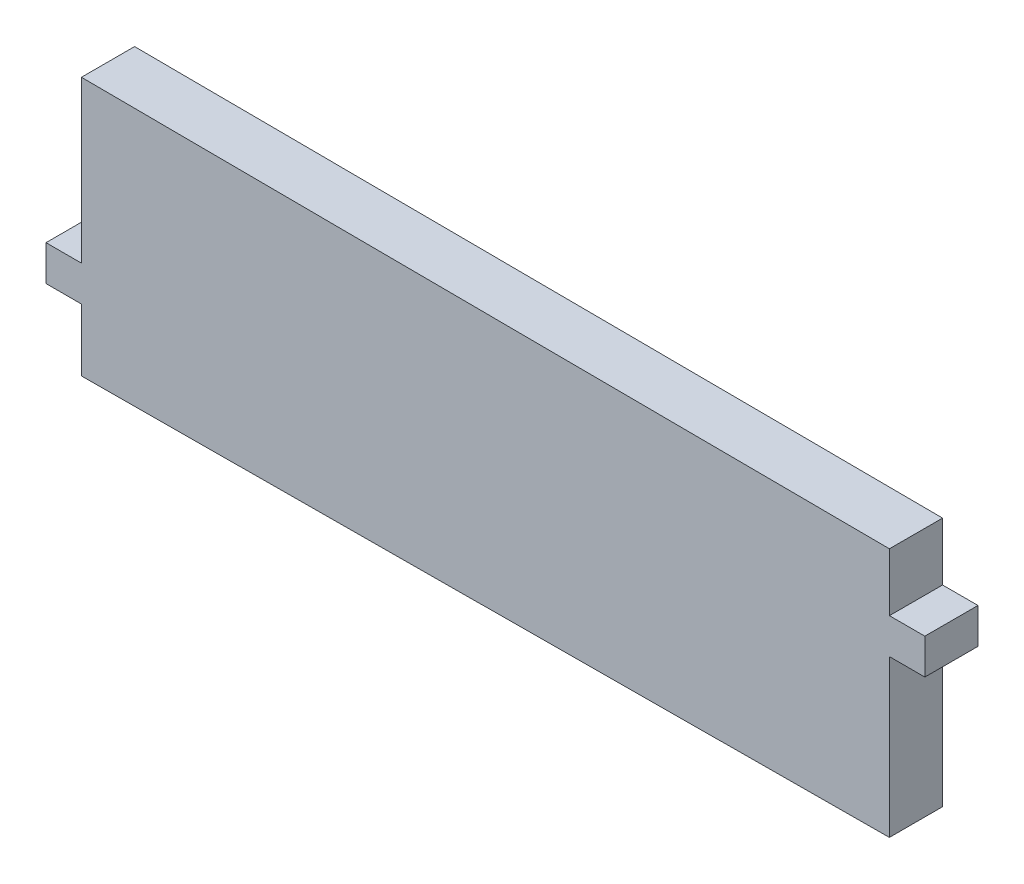
ISO-10303-21;
HEADER;
FILE_DESCRIPTION(('STEP AP214'),'2;1');
FILE_NAME('part.step','',(''),(''),'','','');
FILE_SCHEMA(('AUTOMOTIVE_DESIGN { 1 0 10303 214 1 1 1 1 }'));
ENDSEC;
DATA;
#1=APPLICATION_CONTEXT('core data for automotive mechanical design processes');
#2=APPLICATION_PROTOCOL_DEFINITION('international standard','automotive_design',2000,#1);
#3=PRODUCT_CONTEXT('',#1,'mechanical');
#4=PRODUCT('Part','Part','',(#3));
#5=PRODUCT_RELATED_PRODUCT_CATEGORY('part','',(#4));
#6=PRODUCT_DEFINITION_FORMATION('','',#4);
#7=PRODUCT_DEFINITION_CONTEXT('part definition',#1,'design');
#8=PRODUCT_DEFINITION('design','',#6,#7);
#9=PRODUCT_DEFINITION_SHAPE('','',#8);
#10=(LENGTH_UNIT() NAMED_UNIT(*) SI_UNIT(.MILLI.,.METRE.));
#11=(NAMED_UNIT(*) PLANE_ANGLE_UNIT() SI_UNIT($,.RADIAN.));
#12=(NAMED_UNIT(*) SI_UNIT($,.STERADIAN.) SOLID_ANGLE_UNIT());
#13=UNCERTAINTY_MEASURE_WITH_UNIT(LENGTH_MEASURE(1.E-05),#10,'distance_accuracy_value','');
#14=(GEOMETRIC_REPRESENTATION_CONTEXT(3) GLOBAL_UNCERTAINTY_ASSIGNED_CONTEXT((#13)) GLOBAL_UNIT_ASSIGNED_CONTEXT((#10,
#11,#12)) REPRESENTATION_CONTEXT('',''));
#15=CARTESIAN_POINT('',(0.,0.,0.));
#16=DIRECTION('',(0.,0.,1.));
#17=DIRECTION('',(1.,0.,0.));
#18=AXIS2_PLACEMENT_3D('',#15,#16,#17);
#19=CARTESIAN_POINT('',(15.8059102658461,-23.2863674981757,86.8430095923208));
#20=DIRECTION('',(1.,0.,0.));
#21=DIRECTION('',(0.,0.,-1.));
#22=AXIS2_PLACEMENT_3D('',#19,#20,#21);
#23=PLANE('',#22);
#24=DIRECTION('',(0.,-1.,0.));
#25=VECTOR('',#24,1.);
#26=CARTESIAN_POINT('',(15.8059102658461,-23.2863674981757,4.7625));
#27=LINE('',#26,#25);
#28=CARTESIAN_POINT('',(15.8059102658461,-8.86519562874355,4.7625));
#29=VERTEX_POINT('',#28);
#30=CARTESIAN_POINT('',(15.8059102658461,-23.2863674981757,4.7625));
#31=VERTEX_POINT('',#30);
#32=EDGE_CURVE('E167',#29,#31,#27,.T.);
#33=ORIENTED_EDGE('',*,*,#32,.F.);
#34=DIRECTION('',(0.,0.,-1.));
#35=VECTOR('',#34,1.);
#36=CARTESIAN_POINT('',(15.8059102658461,-8.86519562874355,86.8430095923208));
#37=LINE('',#36,#35);
#38=CARTESIAN_POINT('',(15.8059102658461,-8.86519562874355,0.));
#39=VERTEX_POINT('',#38);
#40=EDGE_CURVE('E36',#29,#39,#37,.T.);
#41=ORIENTED_EDGE('',*,*,#40,.T.);
#42=DIRECTION('',(0.,-1.,0.));
#43=VECTOR('',#42,1.);
#44=CARTESIAN_POINT('',(15.8059102658461,-23.2863674981757,0.));
#45=LINE('',#44,#43);
#46=CARTESIAN_POINT('',(15.8059102658461,-23.2863674981757,0.));
#47=VERTEX_POINT('',#46);
#48=EDGE_CURVE('E175',#39,#47,#45,.T.);
#49=ORIENTED_EDGE('',*,*,#48,.T.);
#50=DIRECTION('',(0.,0.,-1.));
#51=VECTOR('',#50,1.);
#52=CARTESIAN_POINT('',(15.8059102658461,-23.2863674981757,86.8430095923208));
#53=LINE('',#52,#51);
#54=EDGE_CURVE('E103',#31,#47,#53,.T.);
#55=ORIENTED_EDGE('',*,*,#54,.F.);
#56=EDGE_LOOP('',(#33,#41,#49,#55));
#57=FACE_BOUND('',#56,.T.);
#58=ADVANCED_FACE('F32',(#57),#23,.F.);
#59=CARTESIAN_POINT('',(15.8059102658461,-23.2863674981757,86.8430095923208));
#60=DIRECTION('',(0.,-1.,0.));
#61=DIRECTION('',(0.,0.,-1.));
#62=AXIS2_PLACEMENT_3D('',#59,#60,#61);
#63=PLANE('',#62);
#64=DIRECTION('',(-1.,0.,0.));
#65=VECTOR('',#64,1.);
#66=CARTESIAN_POINT('',(15.8059102658461,-23.2863674981757,4.7625));
#67=LINE('',#66,#65);
#68=CARTESIAN_POINT('',(12.6309102658461,-23.2863674981757,4.7625));
#69=VERTEX_POINT('',#68);
#70=EDGE_CURVE('E110',#31,#69,#67,.T.);
#71=ORIENTED_EDGE('',*,*,#70,.F.);
#72=ORIENTED_EDGE('',*,*,#54,.T.);
#73=DIRECTION('',(-1.,0.,0.));
#74=VECTOR('',#73,1.);
#75=CARTESIAN_POINT('',(15.8059102658461,-23.2863674981757,0.));
#76=LINE('',#75,#74);
#77=CARTESIAN_POINT('',(12.6309102658461,-23.2863674981757,0.));
#78=VERTEX_POINT('',#77);
#79=EDGE_CURVE('E174',#47,#78,#76,.T.);
#80=ORIENTED_EDGE('',*,*,#79,.T.);
#81=DIRECTION('',(0.,0.,-1.));
#82=VECTOR('',#81,1.);
#83=CARTESIAN_POINT('',(12.6309102658461,-23.2863674981757,86.8430095923208));
#84=LINE('',#83,#82);
#85=EDGE_CURVE('E176',#69,#78,#84,.T.);
#86=ORIENTED_EDGE('',*,*,#85,.F.);
#87=EDGE_LOOP('',(#71,#72,#80,#86));
#88=FACE_BOUND('',#87,.T.);
#89=ADVANCED_FACE('F225',(#88),#63,.F.);
#90=CARTESIAN_POINT('',(12.6309102658461,-23.2863674981757,86.8430095923208));
#91=DIRECTION('',(1.,0.,0.));
#92=DIRECTION('',(0.,0.,-1.));
#93=AXIS2_PLACEMENT_3D('',#90,#91,#92);
#94=PLANE('',#93);
#95=DIRECTION('',(0.,-1.,0.));
#96=VECTOR('',#95,1.);
#97=CARTESIAN_POINT('',(12.6309102658461,-23.2863674981757,4.7625));
#98=LINE('',#97,#96);
#99=CARTESIAN_POINT('',(12.6309102658461,-26.4613674981758,4.7625));
#100=VERTEX_POINT('',#99);
#101=EDGE_CURVE('E163',#69,#100,#98,.T.);
#102=ORIENTED_EDGE('',*,*,#101,.F.);
#103=ORIENTED_EDGE('',*,*,#85,.T.);
#104=DIRECTION('',(0.,-1.,0.));
#105=VECTOR('',#104,1.);
#106=CARTESIAN_POINT('',(12.6309102658461,-23.2863674981757,0.));
#107=LINE('',#106,#105);
#108=CARTESIAN_POINT('',(12.6309102658461,-26.4613674981758,0.));
#109=VERTEX_POINT('',#108);
#110=EDGE_CURVE('E178',#78,#109,#107,.T.);
#111=ORIENTED_EDGE('',*,*,#110,.T.);
#112=DIRECTION('',(0.,0.,-1.));
#113=VECTOR('',#112,1.);
#114=CARTESIAN_POINT('',(12.6309102658461,-26.4613674981758,86.8430095923208));
#115=LINE('',#114,#113);
#116=EDGE_CURVE('E179',#100,#109,#115,.T.);
#117=ORIENTED_EDGE('',*,*,#116,.F.);
#118=EDGE_LOOP('',(#102,#103,#111,#117));
#119=FACE_BOUND('',#118,.T.);
#120=ADVANCED_FACE('F228',(#119),#94,.F.);
#121=CARTESIAN_POINT('',(12.6309102658461,-26.4613674981758,86.8430095923208));
#122=DIRECTION('',(0.,1.,0.));
#123=DIRECTION('',(0.,0.,1.));
#124=AXIS2_PLACEMENT_3D('',#121,#122,#123);
#125=PLANE('',#124);
#126=DIRECTION('',(1.,0.,0.));
#127=VECTOR('',#126,1.);
#128=CARTESIAN_POINT('',(12.6309102658461,-26.4613674981758,4.7625));
#129=LINE('',#128,#127);
#130=CARTESIAN_POINT('',(15.8059102658461,-26.4613674981758,4.7625));
#131=VERTEX_POINT('',#130);
#132=EDGE_CURVE('E160',#100,#131,#129,.T.);
#133=ORIENTED_EDGE('',*,*,#132,.F.);
#134=ORIENTED_EDGE('',*,*,#116,.T.);
#135=DIRECTION('',(1.,0.,0.));
#136=VECTOR('',#135,1.);
#137=CARTESIAN_POINT('',(12.6309102658461,-26.4613674981758,0.));
#138=LINE('',#137,#136);
#139=CARTESIAN_POINT('',(15.8059102658461,-26.4613674981758,0.));
#140=VERTEX_POINT('',#139);
#141=EDGE_CURVE('E181',#109,#140,#138,.T.);
#142=ORIENTED_EDGE('',*,*,#141,.T.);
#143=DIRECTION('',(0.,0.,-1.));
#144=VECTOR('',#143,1.);
#145=CARTESIAN_POINT('',(15.8059102658461,-26.4613674981758,86.8430095923208));
#146=LINE('',#145,#144);
#147=EDGE_CURVE('E182',#131,#140,#146,.T.);
#148=ORIENTED_EDGE('',*,*,#147,.F.);
#149=EDGE_LOOP('',(#133,#134,#142,#148));
#150=FACE_BOUND('',#149,.T.);
#151=ADVANCED_FACE('F230',(#150),#125,.F.);
#152=CARTESIAN_POINT('',(15.8059102658461,-26.4613674981758,86.8430095923208));
#153=DIRECTION('',(1.,0.,0.));
#154=DIRECTION('',(0.,0.,-1.));
#155=AXIS2_PLACEMENT_3D('',#152,#153,#154);
#156=PLANE('',#155);
#157=DIRECTION('',(0.,-1.,0.));
#158=VECTOR('',#157,1.);
#159=CARTESIAN_POINT('',(15.8059102658461,-26.4613674981758,4.7625));
#160=LINE('',#159,#158);
#161=CARTESIAN_POINT('',(15.8059102658461,-32.0432554037779,4.7625));
#162=VERTEX_POINT('',#161);
#163=EDGE_CURVE('E157',#131,#162,#160,.T.);
#164=ORIENTED_EDGE('',*,*,#163,.F.);
#165=ORIENTED_EDGE('',*,*,#147,.T.);
#166=DIRECTION('',(0.,-1.,0.));
#167=VECTOR('',#166,1.);
#168=CARTESIAN_POINT('',(15.8059102658461,-26.4613674981758,0.));
#169=LINE('',#168,#167);
#170=CARTESIAN_POINT('',(15.8059102658461,-32.0432554037779,0.));
#171=VERTEX_POINT('',#170);
#172=EDGE_CURVE('E184',#140,#171,#169,.T.);
#173=ORIENTED_EDGE('',*,*,#172,.T.);
#174=DIRECTION('',(0.,0.,-1.));
#175=VECTOR('',#174,1.);
#176=CARTESIAN_POINT('',(15.8059102658461,-32.0432554037779,86.8430095923208));
#177=LINE('',#176,#175);
#178=EDGE_CURVE('E185',#162,#171,#177,.T.);
#179=ORIENTED_EDGE('',*,*,#178,.F.);
#180=EDGE_LOOP('',(#164,#165,#173,#179));
#181=FACE_BOUND('',#180,.T.);
#182=ADVANCED_FACE('F234',(#181),#156,.F.);
#183=CARTESIAN_POINT('',(88.195910265846,-31.6534261453967,86.8430095923208));
#184=DIRECTION('',(-0.0053850477422544,0.99998550052529,0.));
#185=DIRECTION('',(-0.99998550052529,-0.0053850477422544,0.));
#186=AXIS2_PLACEMENT_3D('',#183,#184,#185);
#187=PLANE('',#186);
#188=DIRECTION('',(0.99998550052529,0.0053850477422544,0.));
#189=VECTOR('',#188,1.);
#190=CARTESIAN_POINT('',(88.195910265846,-31.6534261453967,4.7625));
#191=LINE('',#190,#189);
#192=CARTESIAN_POINT('',(88.195910265846,-31.6534261453967,4.7625));
#193=VERTEX_POINT('',#192);
#194=EDGE_CURVE('E154',#162,#193,#191,.T.);
#195=ORIENTED_EDGE('',*,*,#194,.F.);
#196=ORIENTED_EDGE('',*,*,#178,.T.);
#197=DIRECTION('',(0.99998550052529,0.0053850477422544,0.));
#198=VECTOR('',#197,1.);
#199=CARTESIAN_POINT('',(88.195910265846,-31.6534261453967,0.));
#200=LINE('',#199,#198);
#201=CARTESIAN_POINT('',(88.195910265846,-31.6534261453967,0.));
#202=VERTEX_POINT('',#201);
#203=EDGE_CURVE('E187',#171,#202,#200,.T.);
#204=ORIENTED_EDGE('',*,*,#203,.T.);
#205=DIRECTION('',(0.,0.,-1.));
#206=VECTOR('',#205,1.);
#207=CARTESIAN_POINT('',(88.195910265846,-31.6534261453967,86.8430095923208));
#208=LINE('',#207,#206);
#209=EDGE_CURVE('E188',#193,#202,#208,.T.);
#210=ORIENTED_EDGE('',*,*,#209,.F.);
#211=EDGE_LOOP('',(#195,#196,#204,#210));
#212=FACE_BOUND('',#211,.T.);
#213=ADVANCED_FACE('F239',(#212),#187,.F.);
#214=CARTESIAN_POINT('',(88.195910265846,-17.6221674981758,86.8430095923208));
#215=DIRECTION('',(-1.,0.,0.));
#216=DIRECTION('',(0.,0.,1.));
#217=AXIS2_PLACEMENT_3D('',#214,#215,#216);
#218=PLANE('',#217);
#219=DIRECTION('',(0.,1.,0.));
#220=VECTOR('',#219,1.);
#221=CARTESIAN_POINT('',(88.195910265846,-17.6221674981758,4.7625));
#222=LINE('',#221,#220);
#223=CARTESIAN_POINT('',(88.195910265846,-17.6221674981758,4.7625));
#224=VERTEX_POINT('',#223);
#225=EDGE_CURVE('E151',#193,#224,#222,.T.);
#226=ORIENTED_EDGE('',*,*,#225,.F.);
#227=ORIENTED_EDGE('',*,*,#209,.T.);
#228=DIRECTION('',(0.,1.,0.));
#229=VECTOR('',#228,1.);
#230=CARTESIAN_POINT('',(88.195910265846,-17.6221674981758,0.));
#231=LINE('',#230,#229);
#232=CARTESIAN_POINT('',(88.195910265846,-17.6221674981758,0.));
#233=VERTEX_POINT('',#232);
#234=EDGE_CURVE('E190',#202,#233,#231,.T.);
#235=ORIENTED_EDGE('',*,*,#234,.T.);
#236=DIRECTION('',(0.,0.,-1.));
#237=VECTOR('',#236,1.);
#238=CARTESIAN_POINT('',(88.195910265846,-17.6221674981758,86.8430095923208));
#239=LINE('',#238,#237);
#240=EDGE_CURVE('E191',#224,#233,#239,.T.);
#241=ORIENTED_EDGE('',*,*,#240,.F.);
#242=EDGE_LOOP('',(#226,#227,#235,#241));
#243=FACE_BOUND('',#242,.T.);
#244=ADVANCED_FACE('F242',(#243),#218,.F.);
#245=CARTESIAN_POINT('',(88.195910265846,-17.6221674981758,86.8430095923208));
#246=DIRECTION('',(0.,1.,0.));
#247=DIRECTION('',(0.,0.,1.));
#248=AXIS2_PLACEMENT_3D('',#245,#246,#247);
#249=PLANE('',#248);
#250=DIRECTION('',(1.,0.,0.));
#251=VECTOR('',#250,1.);
#252=CARTESIAN_POINT('',(88.195910265846,-17.6221674981758,4.7625));
#253=LINE('',#252,#251);
#254=CARTESIAN_POINT('',(91.370910265846,-17.6221674981758,4.7625));
#255=VERTEX_POINT('',#254);
#256=EDGE_CURVE('E146',#224,#255,#253,.T.);
#257=ORIENTED_EDGE('',*,*,#256,.F.);
#258=ORIENTED_EDGE('',*,*,#240,.T.);
#259=DIRECTION('',(1.,0.,0.));
#260=VECTOR('',#259,1.);
#261=CARTESIAN_POINT('',(88.195910265846,-17.6221674981758,0.));
#262=LINE('',#261,#260);
#263=CARTESIAN_POINT('',(91.370910265846,-17.6221674981758,0.));
#264=VERTEX_POINT('',#263);
#265=EDGE_CURVE('E193',#233,#264,#262,.T.);
#266=ORIENTED_EDGE('',*,*,#265,.T.);
#267=DIRECTION('',(0.,0.,-1.));
#268=VECTOR('',#267,1.);
#269=CARTESIAN_POINT('',(91.370910265846,-17.6221674981758,86.8430095923208));
#270=LINE('',#269,#268);
#271=EDGE_CURVE('E194',#255,#264,#270,.T.);
#272=ORIENTED_EDGE('',*,*,#271,.F.);
#273=EDGE_LOOP('',(#257,#258,#266,#272));
#274=FACE_BOUND('',#273,.T.);
#275=ADVANCED_FACE('F246',(#274),#249,.F.);
#276=CARTESIAN_POINT('',(91.370910265846,-17.6221674981758,86.8430095923208));
#277=DIRECTION('',(-1.,0.,0.));
#278=DIRECTION('',(0.,0.,1.));
#279=AXIS2_PLACEMENT_3D('',#276,#277,#278);
#280=PLANE('',#279);
#281=DIRECTION('',(0.,1.,0.));
#282=VECTOR('',#281,1.);
#283=CARTESIAN_POINT('',(91.370910265846,-17.6221674981758,4.7625));
#284=LINE('',#283,#282);
#285=CARTESIAN_POINT('',(91.370910265846,-14.4471674981758,4.7625));
#286=VERTEX_POINT('',#285);
#287=EDGE_CURVE('E144',#255,#286,#284,.T.);
#288=ORIENTED_EDGE('',*,*,#287,.F.);
#289=ORIENTED_EDGE('',*,*,#271,.T.);
#290=DIRECTION('',(0.,1.,0.));
#291=VECTOR('',#290,1.);
#292=CARTESIAN_POINT('',(91.370910265846,-17.6221674981758,0.));
#293=LINE('',#292,#291);
#294=CARTESIAN_POINT('',(91.370910265846,-14.4471674981758,0.));
#295=VERTEX_POINT('',#294);
#296=EDGE_CURVE('E196',#264,#295,#293,.T.);
#297=ORIENTED_EDGE('',*,*,#296,.T.);
#298=DIRECTION('',(0.,0.,-1.));
#299=VECTOR('',#298,1.);
#300=CARTESIAN_POINT('',(91.370910265846,-14.4471674981758,86.8430095923208));
#301=LINE('',#300,#299);
#302=EDGE_CURVE('E197',#286,#295,#301,.T.);
#303=ORIENTED_EDGE('',*,*,#302,.F.);
#304=EDGE_LOOP('',(#288,#289,#297,#303));
#305=FACE_BOUND('',#304,.T.);
#306=ADVANCED_FACE('F250',(#305),#280,.F.);
#307=CARTESIAN_POINT('',(91.370910265846,-14.4471674981758,86.8430095923208));
#308=DIRECTION('',(0.,-1.,0.));
#309=DIRECTION('',(0.,0.,-1.));
#310=AXIS2_PLACEMENT_3D('',#307,#308,#309);
#311=PLANE('',#310);
#312=DIRECTION('',(-1.,0.,0.));
#313=VECTOR('',#312,1.);
#314=CARTESIAN_POINT('',(91.370910265846,-14.4471674981758,4.7625));
#315=LINE('',#314,#313);
#316=CARTESIAN_POINT('',(88.195910265846,-14.4471674981758,4.7625));
#317=VERTEX_POINT('',#316);
#318=EDGE_CURVE('E41',#286,#317,#315,.T.);
#319=ORIENTED_EDGE('',*,*,#318,.F.);
#320=ORIENTED_EDGE('',*,*,#302,.T.);
#321=DIRECTION('',(-1.,0.,0.));
#322=VECTOR('',#321,1.);
#323=CARTESIAN_POINT('',(91.370910265846,-14.4471674981758,0.));
#324=LINE('',#323,#322);
#325=CARTESIAN_POINT('',(88.195910265846,-14.4471674981758,0.));
#326=VERTEX_POINT('',#325);
#327=EDGE_CURVE('E138',#295,#326,#324,.T.);
#328=ORIENTED_EDGE('',*,*,#327,.T.);
#329=DIRECTION('',(0.,0.,-1.));
#330=VECTOR('',#329,1.);
#331=CARTESIAN_POINT('',(88.195910265846,-14.4471674981758,86.8430095923208));
#332=LINE('',#331,#330);
#333=EDGE_CURVE('E129',#317,#326,#332,.T.);
#334=ORIENTED_EDGE('',*,*,#333,.F.);
#335=EDGE_LOOP('',(#319,#320,#328,#334));
#336=FACE_BOUND('',#335,.T.);
#337=ADVANCED_FACE('F135',(#336),#311,.F.);
#338=CARTESIAN_POINT('',(88.195910265846,-14.4471674981758,86.8430095923208));
#339=DIRECTION('',(-1.,0.,0.));
#340=DIRECTION('',(0.,0.,1.));
#341=AXIS2_PLACEMENT_3D('',#338,#339,#340);
#342=PLANE('',#341);
#343=DIRECTION('',(0.,1.,0.));
#344=VECTOR('',#343,1.);
#345=CARTESIAN_POINT('',(88.195910265846,-14.4471674981758,4.7625));
#346=LINE('',#345,#344);
#347=CARTESIAN_POINT('',(88.195910265846,-9.25604165513505,4.7625));
#348=VERTEX_POINT('',#347);
#349=EDGE_CURVE('E11',#317,#348,#346,.T.);
#350=ORIENTED_EDGE('',*,*,#349,.F.);
#351=ORIENTED_EDGE('',*,*,#333,.T.);
#352=DIRECTION('',(0.,1.,0.));
#353=VECTOR('',#352,1.);
#354=CARTESIAN_POINT('',(88.195910265846,-14.4471674981758,0.));
#355=LINE('',#354,#353);
#356=CARTESIAN_POINT('',(88.195910265846,-9.25604165513505,0.));
#357=VERTEX_POINT('',#356);
#358=EDGE_CURVE('E140',#326,#357,#355,.T.);
#359=ORIENTED_EDGE('',*,*,#358,.T.);
#360=DIRECTION('',(0.,0.,-1.));
#361=VECTOR('',#360,1.);
#362=CARTESIAN_POINT('',(88.195910265846,-9.25604165513505,86.8430095923208));
#363=LINE('',#362,#361);
#364=EDGE_CURVE('E54',#348,#357,#363,.T.);
#365=ORIENTED_EDGE('',*,*,#364,.F.);
#366=EDGE_LOOP('',(#350,#351,#359,#365));
#367=FACE_BOUND('',#366,.T.);
#368=ADVANCED_FACE('F128',(#367),#342,.F.);
#369=CARTESIAN_POINT('',(15.8059102658461,-8.86519562874355,86.8430095923208));
#370=DIRECTION('',(-0.00539909282676352,-0.999985424792106,0.));
#371=DIRECTION('',(0.999985424792106,-0.00539909282676352,0.));
#372=AXIS2_PLACEMENT_3D('',#369,#370,#371);
#373=PLANE('',#372);
#374=DIRECTION('',(-0.999985424792106,0.00539909282676352,0.));
#375=VECTOR('',#374,1.);
#376=CARTESIAN_POINT('',(15.8059102658461,-8.86519562874355,4.7625));
#377=LINE('',#376,#375);
#378=EDGE_CURVE('E170',#348,#29,#377,.T.);
#379=ORIENTED_EDGE('',*,*,#378,.F.);
#380=ORIENTED_EDGE('',*,*,#364,.T.);
#381=DIRECTION('',(-0.999985424792106,0.00539909282676352,0.));
#382=VECTOR('',#381,1.);
#383=CARTESIAN_POINT('',(15.8059102658461,-8.86519562874355,0.));
#384=LINE('',#383,#382);
#385=EDGE_CURVE('E172',#357,#39,#384,.T.);
#386=ORIENTED_EDGE('',*,*,#385,.T.);
#387=ORIENTED_EDGE('',*,*,#40,.F.);
#388=EDGE_LOOP('',(#379,#380,#386,#387));
#389=FACE_BOUND('',#388,.T.);
#390=ADVANCED_FACE('F220',(#389),#373,.F.);
#391=CARTESIAN_POINT('',(0.,0.,0.));
#392=DIRECTION('',(0.,0.,1.));
#393=DIRECTION('',(1.,0.,0.));
#394=AXIS2_PLACEMENT_3D('',#391,#392,#393);
#395=PLANE('',#394);
#396=ORIENTED_EDGE('',*,*,#48,.F.);
#397=ORIENTED_EDGE('',*,*,#385,.F.);
#398=ORIENTED_EDGE('',*,*,#358,.F.);
#399=ORIENTED_EDGE('',*,*,#327,.F.);
#400=ORIENTED_EDGE('',*,*,#296,.F.);
#401=ORIENTED_EDGE('',*,*,#265,.F.);
#402=ORIENTED_EDGE('',*,*,#234,.F.);
#403=ORIENTED_EDGE('',*,*,#203,.F.);
#404=ORIENTED_EDGE('',*,*,#172,.F.);
#405=ORIENTED_EDGE('',*,*,#141,.F.);
#406=ORIENTED_EDGE('',*,*,#110,.F.);
#407=ORIENTED_EDGE('',*,*,#79,.F.);
#408=EDGE_LOOP('',(#396,#397,#398,#399,#400,#401,#402,#403,#404,#405,#406,#407));
#409=FACE_BOUND('',#408,.T.);
#410=ADVANCED_FACE('F222',(#409),#395,.F.);
#411=CARTESIAN_POINT('',(318.188719107862,-26.4613674981758,4.7625));
#412=DIRECTION('',(0.,0.,1.));
#413=DIRECTION('',(1.,0.,0.));
#414=AXIS2_PLACEMENT_3D('',#411,#412,#413);
#415=PLANE('',#414);
#416=ORIENTED_EDGE('',*,*,#378,.T.);
#417=ORIENTED_EDGE('',*,*,#32,.T.);
#418=ORIENTED_EDGE('',*,*,#70,.T.);
#419=ORIENTED_EDGE('',*,*,#101,.T.);
#420=ORIENTED_EDGE('',*,*,#132,.T.);
#421=ORIENTED_EDGE('',*,*,#163,.T.);
#422=ORIENTED_EDGE('',*,*,#194,.T.);
#423=ORIENTED_EDGE('',*,*,#225,.T.);
#424=ORIENTED_EDGE('',*,*,#256,.T.);
#425=ORIENTED_EDGE('',*,*,#287,.T.);
#426=ORIENTED_EDGE('',*,*,#318,.T.);
#427=ORIENTED_EDGE('',*,*,#349,.T.);
#428=EDGE_LOOP('',(#416,#417,#418,#419,#420,#421,#422,#423,#424,#425,#426,#427));
#429=FACE_BOUND('',#428,.T.);
#430=ADVANCED_FACE('F34',(#429),#415,.T.);
#431=CLOSED_SHELL('',(#58,#89,#120,#151,#182,#213,#244,#275,#306,#337,#368,#390,#410,#430));
#432=MANIFOLD_SOLID_BREP('B2',#431);
#433=ADVANCED_BREP_SHAPE_REPRESENTATION('',(#18,#432),#14);
#434=SHAPE_DEFINITION_REPRESENTATION(#9,#433);
ENDSEC;
END-ISO-10303-21;
